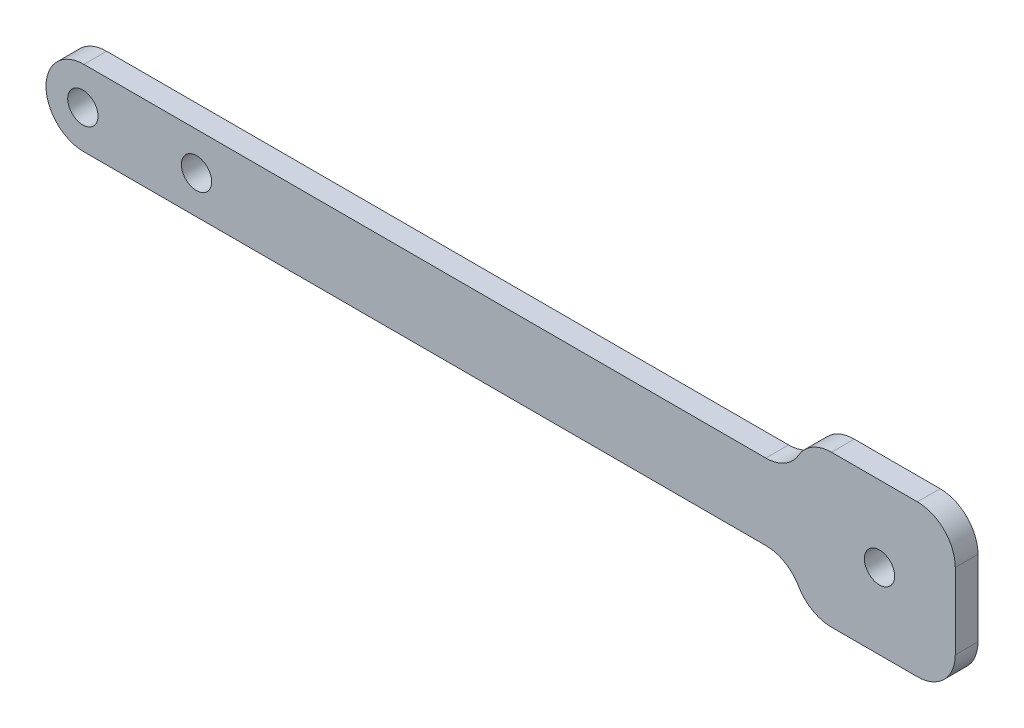
ISO-10303-21;
HEADER;
FILE_DESCRIPTION(('STEP AP214'),'2;1');
FILE_NAME('part.step','',(''),(''),'','','');
FILE_SCHEMA(('AUTOMOTIVE_DESIGN { 1 0 10303 214 1 1 1 1 }'));
ENDSEC;
DATA;
#1=APPLICATION_CONTEXT('core data for automotive mechanical design processes');
#2=APPLICATION_PROTOCOL_DEFINITION('international standard','automotive_design',2000,#1);
#3=PRODUCT_CONTEXT('',#1,'mechanical');
#4=PRODUCT('Part','Part','',(#3));
#5=PRODUCT_RELATED_PRODUCT_CATEGORY('part','',(#4));
#6=PRODUCT_DEFINITION_FORMATION('','',#4);
#7=PRODUCT_DEFINITION_CONTEXT('part definition',#1,'design');
#8=PRODUCT_DEFINITION('design','',#6,#7);
#9=PRODUCT_DEFINITION_SHAPE('','',#8);
#10=(LENGTH_UNIT() NAMED_UNIT(*) SI_UNIT(.MILLI.,.METRE.));
#11=(NAMED_UNIT(*) PLANE_ANGLE_UNIT() SI_UNIT($,.RADIAN.));
#12=(NAMED_UNIT(*) SI_UNIT($,.STERADIAN.) SOLID_ANGLE_UNIT());
#13=UNCERTAINTY_MEASURE_WITH_UNIT(LENGTH_MEASURE(1.E-05),#10,'distance_accuracy_value','');
#14=(GEOMETRIC_REPRESENTATION_CONTEXT(3) GLOBAL_UNCERTAINTY_ASSIGNED_CONTEXT((#13)) GLOBAL_UNIT_ASSIGNED_CONTEXT((#10,
#11,#12)) REPRESENTATION_CONTEXT('',''));
#15=CARTESIAN_POINT('',(0.,0.,0.));
#16=DIRECTION('',(0.,0.,1.));
#17=DIRECTION('',(1.,0.,0.));
#18=AXIS2_PLACEMENT_3D('',#15,#16,#17);
#19=CARTESIAN_POINT('',(0.,0.,3.));
#20=DIRECTION('',(0.,0.,-1.));
#21=DIRECTION('',(-1.,0.,0.));
#22=AXIS2_PLACEMENT_3D('',#19,#20,#21);
#23=PLANE('',#22);
#24=DIRECTION('',(-1.,0.,0.));
#25=VECTOR('',#24,1.);
#26=CARTESIAN_POINT('',(40.,10.,3.));
#27=LINE('',#26,#25);
#28=CARTESIAN_POINT('',(55.,10.,3.));
#29=VERTEX_POINT('',#28);
#30=CARTESIAN_POINT('',(43.6602540378444,10.,3.));
#31=VERTEX_POINT('',#30);
#32=EDGE_CURVE('E259',#29,#31,#27,.T.);
#33=ORIENTED_EDGE('',*,*,#32,.T.);
#34=CARTESIAN_POINT('',(43.6602540378444,5.,3.));
#35=DIRECTION('',(0.,0.,-1.));
#36=DIRECTION('',(-1.,0.,0.));
#37=AXIS2_PLACEMENT_3D('',#34,#35,#36);
#38=CIRCLE('',#37,5.);
#39=CARTESIAN_POINT('',(39.3301270189222,7.5,3.));
#40=VERTEX_POINT('',#39);
#41=EDGE_CURVE('E223',#31,#40,#38,.F.);
#42=ORIENTED_EDGE('',*,*,#41,.T.);
#43=CARTESIAN_POINT('',(35.,10.,3.));
#44=DIRECTION('',(0.,0.,-1.));
#45=DIRECTION('',(-1.,0.,0.));
#46=AXIS2_PLACEMENT_3D('',#43,#44,#45);
#47=CIRCLE('',#46,5.);
#48=CARTESIAN_POINT('',(35.,5.,3.));
#49=VERTEX_POINT('',#48);
#50=EDGE_CURVE('E212',#40,#49,#47,.T.);
#51=ORIENTED_EDGE('',*,*,#50,.T.);
#52=DIRECTION('',(-1.,0.,0.));
#53=VECTOR('',#52,1.);
#54=CARTESIAN_POINT('',(-60.,5.,3.));
#55=LINE('',#54,#53);
#56=CARTESIAN_POINT('',(-55.,5.,3.));
#57=VERTEX_POINT('',#56);
#58=EDGE_CURVE('E264',#49,#57,#55,.T.);
#59=ORIENTED_EDGE('',*,*,#58,.T.);
#60=CARTESIAN_POINT('',(-55.,0.,3.));
#61=DIRECTION('',(0.,0.,-1.));
#62=DIRECTION('',(-1.,0.,0.));
#63=AXIS2_PLACEMENT_3D('',#60,#61,#62);
#64=CIRCLE('',#63,5.);
#65=CARTESIAN_POINT('',(-60.,0.,3.));
#66=VERTEX_POINT('',#65);
#67=EDGE_CURVE('E181',#57,#66,#64,.F.);
#68=ORIENTED_EDGE('',*,*,#67,.T.);
#69=CARTESIAN_POINT('',(-55.,0.,3.));
#70=DIRECTION('',(0.,0.,-1.));
#71=DIRECTION('',(-1.,0.,0.));
#72=AXIS2_PLACEMENT_3D('',#69,#70,#71);
#73=CIRCLE('',#72,5.);
#74=CARTESIAN_POINT('',(-54.9999999999999,-5.,3.));
#75=VERTEX_POINT('',#74);
#76=EDGE_CURVE('E182',#66,#75,#73,.F.);
#77=ORIENTED_EDGE('',*,*,#76,.T.);
#78=DIRECTION('',(1.,0.,0.));
#79=VECTOR('',#78,1.);
#80=CARTESIAN_POINT('',(40.,-5.,3.));
#81=LINE('',#80,#79);
#82=CARTESIAN_POINT('',(35.,-5.,3.));
#83=VERTEX_POINT('',#82);
#84=EDGE_CURVE('E160',#75,#83,#81,.T.);
#85=ORIENTED_EDGE('',*,*,#84,.T.);
#86=CARTESIAN_POINT('',(35.,-10.,3.));
#87=DIRECTION('',(0.,0.,-1.));
#88=DIRECTION('',(-1.,0.,0.));
#89=AXIS2_PLACEMENT_3D('',#86,#87,#88);
#90=CIRCLE('',#89,5.);
#91=CARTESIAN_POINT('',(39.3301270189222,-7.5,3.));
#92=VERTEX_POINT('',#91);
#93=EDGE_CURVE('E210',#83,#92,#90,.T.);
#94=ORIENTED_EDGE('',*,*,#93,.T.);
#95=CARTESIAN_POINT('',(43.6602540378444,-5.,3.));
#96=DIRECTION('',(0.,0.,-1.));
#97=DIRECTION('',(-1.,0.,0.));
#98=AXIS2_PLACEMENT_3D('',#95,#96,#97);
#99=CIRCLE('',#98,5.);
#100=CARTESIAN_POINT('',(43.6602540378444,-10.,3.));
#101=VERTEX_POINT('',#100);
#102=EDGE_CURVE('E57',#92,#101,#99,.F.);
#103=ORIENTED_EDGE('',*,*,#102,.T.);
#104=DIRECTION('',(1.,0.,0.));
#105=VECTOR('',#104,1.);
#106=CARTESIAN_POINT('',(60.,-10.,3.));
#107=LINE('',#106,#105);
#108=CARTESIAN_POINT('',(55.,-10.,3.));
#109=VERTEX_POINT('',#108);
#110=EDGE_CURVE('E165',#101,#109,#107,.T.);
#111=ORIENTED_EDGE('',*,*,#110,.T.);
#112=CARTESIAN_POINT('',(55.,-5.,3.));
#113=DIRECTION('',(0.,0.,-1.));
#114=DIRECTION('',(-1.,0.,0.));
#115=AXIS2_PLACEMENT_3D('',#112,#113,#114);
#116=CIRCLE('',#115,5.);
#117=CARTESIAN_POINT('',(60.,-5.,3.));
#118=VERTEX_POINT('',#117);
#119=EDGE_CURVE('E177',#109,#118,#116,.F.);
#120=ORIENTED_EDGE('',*,*,#119,.T.);
#121=DIRECTION('',(0.,1.,0.));
#122=VECTOR('',#121,1.);
#123=CARTESIAN_POINT('',(60.,10.,3.));
#124=LINE('',#123,#122);
#125=CARTESIAN_POINT('',(60.,5.,3.));
#126=VERTEX_POINT('',#125);
#127=EDGE_CURVE('E170',#118,#126,#124,.T.);
#128=ORIENTED_EDGE('',*,*,#127,.T.);
#129=CARTESIAN_POINT('',(55.,5.,3.));
#130=DIRECTION('',(0.,0.,-1.));
#131=DIRECTION('',(-1.,0.,0.));
#132=AXIS2_PLACEMENT_3D('',#129,#130,#131);
#133=CIRCLE('',#132,5.);
#134=EDGE_CURVE('E150',#126,#29,#133,.F.);
#135=ORIENTED_EDGE('',*,*,#134,.T.);
#136=EDGE_LOOP('',(#33,#42,#51,#59,#68,#77,#85,#94,#103,#111,#120,#128,#135));
#137=FACE_BOUND('',#136,.T.);
#138=CARTESIAN_POINT('',(-55.1384875953274,0.,3.));
#139=DIRECTION('',(0.,0.,1.));
#140=DIRECTION('',(1.,0.,0.));
#141=AXIS2_PLACEMENT_3D('',#138,#139,#140);
#142=CIRCLE('',#141,2.);
#143=CARTESIAN_POINT('',(-53.1384875953274,0.,3.));
#144=VERTEX_POINT('',#143);
#145=EDGE_CURVE('E234',#144,#144,#142,.T.);
#146=ORIENTED_EDGE('',*,*,#145,.F.);
#147=EDGE_LOOP('',(#146));
#148=FACE_BOUND('',#147,.T.);
#149=CARTESIAN_POINT('',(-40.1384875953274,0.,3.));
#150=DIRECTION('',(0.,0.,1.));
#151=DIRECTION('',(1.,0.,0.));
#152=AXIS2_PLACEMENT_3D('',#149,#150,#151);
#153=CIRCLE('',#152,2.);
#154=CARTESIAN_POINT('',(-38.1384875953274,0.,3.));
#155=VERTEX_POINT('',#154);
#156=EDGE_CURVE('E273',#155,#155,#153,.T.);
#157=ORIENTED_EDGE('',*,*,#156,.F.);
#158=EDGE_LOOP('',(#157));
#159=FACE_BOUND('',#158,.T.);
#160=CARTESIAN_POINT('',(50.,0.,3.));
#161=DIRECTION('',(0.,0.,1.));
#162=DIRECTION('',(1.,0.,0.));
#163=AXIS2_PLACEMENT_3D('',#160,#161,#162);
#164=CIRCLE('',#163,2.);
#165=CARTESIAN_POINT('',(52.,0.,3.));
#166=VERTEX_POINT('',#165);
#167=EDGE_CURVE('E278',#166,#166,#164,.T.);
#168=ORIENTED_EDGE('',*,*,#167,.F.);
#169=EDGE_LOOP('',(#168));
#170=FACE_BOUND('',#169,.T.);
#171=ADVANCED_FACE('F41',(#137,#148,#159,#170),#23,.F.);
#172=CARTESIAN_POINT('',(0.,0.,0.));
#173=DIRECTION('',(0.,0.,-1.));
#174=DIRECTION('',(-1.,0.,0.));
#175=AXIS2_PLACEMENT_3D('',#172,#173,#174);
#176=PLANE('',#175);
#177=CARTESIAN_POINT('',(-40.1384875953274,0.,0.));
#178=DIRECTION('',(0.,0.,1.));
#179=DIRECTION('',(1.,0.,0.));
#180=AXIS2_PLACEMENT_3D('',#177,#178,#179);
#181=CIRCLE('',#180,2.);
#182=CARTESIAN_POINT('',(-38.1384875953274,0.,0.));
#183=VERTEX_POINT('',#182);
#184=EDGE_CURVE('E280',#183,#183,#181,.T.);
#185=ORIENTED_EDGE('',*,*,#184,.T.);
#186=EDGE_LOOP('',(#185));
#187=FACE_BOUND('',#186,.T.);
#188=CARTESIAN_POINT('',(35.,10.,0.));
#189=DIRECTION('',(0.,0.,-1.));
#190=DIRECTION('',(-1.,0.,0.));
#191=AXIS2_PLACEMENT_3D('',#188,#189,#190);
#192=CIRCLE('',#191,5.);
#193=CARTESIAN_POINT('',(35.,5.,0.));
#194=VERTEX_POINT('',#193);
#195=CARTESIAN_POINT('',(39.3301270189222,7.5,0.));
#196=VERTEX_POINT('',#195);
#197=EDGE_CURVE('E209',#194,#196,#192,.F.);
#198=ORIENTED_EDGE('',*,*,#197,.T.);
#199=CARTESIAN_POINT('',(43.6602540378444,5.,0.));
#200=DIRECTION('',(0.,0.,-1.));
#201=DIRECTION('',(-1.,0.,0.));
#202=AXIS2_PLACEMENT_3D('',#199,#200,#201);
#203=CIRCLE('',#202,5.);
#204=CARTESIAN_POINT('',(43.6602540378444,10.,0.));
#205=VERTEX_POINT('',#204);
#206=EDGE_CURVE('E218',#196,#205,#203,.T.);
#207=ORIENTED_EDGE('',*,*,#206,.T.);
#208=DIRECTION('',(-1.,0.,0.));
#209=VECTOR('',#208,1.);
#210=CARTESIAN_POINT('',(40.,10.,0.));
#211=LINE('',#210,#209);
#212=CARTESIAN_POINT('',(55.,10.,0.));
#213=VERTEX_POINT('',#212);
#214=EDGE_CURVE('E169',#213,#205,#211,.T.);
#215=ORIENTED_EDGE('',*,*,#214,.F.);
#216=CARTESIAN_POINT('',(55.,5.,0.));
#217=DIRECTION('',(0.,0.,-1.));
#218=DIRECTION('',(-1.,0.,0.));
#219=AXIS2_PLACEMENT_3D('',#216,#217,#218);
#220=CIRCLE('',#219,5.);
#221=CARTESIAN_POINT('',(60.,5.,0.));
#222=VERTEX_POINT('',#221);
#223=EDGE_CURVE('E158',#213,#222,#220,.T.);
#224=ORIENTED_EDGE('',*,*,#223,.T.);
#225=DIRECTION('',(0.,1.,0.));
#226=VECTOR('',#225,1.);
#227=CARTESIAN_POINT('',(60.,10.,0.));
#228=LINE('',#227,#226);
#229=CARTESIAN_POINT('',(60.,-5.,0.));
#230=VERTEX_POINT('',#229);
#231=EDGE_CURVE('E231',#230,#222,#228,.T.);
#232=ORIENTED_EDGE('',*,*,#231,.F.);
#233=CARTESIAN_POINT('',(55.,-5.,0.));
#234=DIRECTION('',(0.,0.,-1.));
#235=DIRECTION('',(-1.,0.,0.));
#236=AXIS2_PLACEMENT_3D('',#233,#234,#235);
#237=CIRCLE('',#236,5.);
#238=CARTESIAN_POINT('',(55.,-10.,0.));
#239=VERTEX_POINT('',#238);
#240=EDGE_CURVE('E172',#230,#239,#237,.T.);
#241=ORIENTED_EDGE('',*,*,#240,.T.);
#242=DIRECTION('',(1.,0.,0.));
#243=VECTOR('',#242,1.);
#244=CARTESIAN_POINT('',(60.,-10.,0.));
#245=LINE('',#244,#243);
#246=CARTESIAN_POINT('',(43.6602540378444,-10.,0.));
#247=VERTEX_POINT('',#246);
#248=EDGE_CURVE('E230',#247,#239,#245,.T.);
#249=ORIENTED_EDGE('',*,*,#248,.F.);
#250=CARTESIAN_POINT('',(43.6602540378444,-5.,0.));
#251=DIRECTION('',(0.,0.,-1.));
#252=DIRECTION('',(-1.,0.,0.));
#253=AXIS2_PLACEMENT_3D('',#250,#251,#252);
#254=CIRCLE('',#253,5.);
#255=CARTESIAN_POINT('',(39.3301270189222,-7.5,0.));
#256=VERTEX_POINT('',#255);
#257=EDGE_CURVE('E216',#247,#256,#254,.T.);
#258=ORIENTED_EDGE('',*,*,#257,.T.);
#259=CARTESIAN_POINT('',(35.,-10.,0.));
#260=DIRECTION('',(0.,0.,-1.));
#261=DIRECTION('',(-1.,0.,0.));
#262=AXIS2_PLACEMENT_3D('',#259,#260,#261);
#263=CIRCLE('',#262,5.);
#264=CARTESIAN_POINT('',(35.,-5.,0.));
#265=VERTEX_POINT('',#264);
#266=EDGE_CURVE('E161',#256,#265,#263,.F.);
#267=ORIENTED_EDGE('',*,*,#266,.T.);
#268=DIRECTION('',(1.,0.,0.));
#269=VECTOR('',#268,1.);
#270=CARTESIAN_POINT('',(40.,-5.,0.));
#271=LINE('',#270,#269);
#272=CARTESIAN_POINT('',(-54.9999999999999,-5.,0.));
#273=VERTEX_POINT('',#272);
#274=EDGE_CURVE('E152',#273,#265,#271,.T.);
#275=ORIENTED_EDGE('',*,*,#274,.F.);
#276=CARTESIAN_POINT('',(-55.,0.,0.));
#277=DIRECTION('',(0.,0.,-1.));
#278=DIRECTION('',(-1.,0.,0.));
#279=AXIS2_PLACEMENT_3D('',#276,#277,#278);
#280=CIRCLE('',#279,5.);
#281=CARTESIAN_POINT('',(-60.,0.,0.));
#282=VERTEX_POINT('',#281);
#283=EDGE_CURVE('E136',#273,#282,#280,.T.);
#284=ORIENTED_EDGE('',*,*,#283,.T.);
#285=CARTESIAN_POINT('',(-55.,0.,0.));
#286=DIRECTION('',(0.,0.,-1.));
#287=DIRECTION('',(-1.,0.,0.));
#288=AXIS2_PLACEMENT_3D('',#285,#286,#287);
#289=CIRCLE('',#288,5.);
#290=CARTESIAN_POINT('',(-55.,5.,0.));
#291=VERTEX_POINT('',#290);
#292=EDGE_CURVE('E149',#282,#291,#289,.T.);
#293=ORIENTED_EDGE('',*,*,#292,.T.);
#294=DIRECTION('',(-1.,0.,0.));
#295=VECTOR('',#294,1.);
#296=CARTESIAN_POINT('',(-60.,5.,0.));
#297=LINE('',#296,#295);
#298=EDGE_CURVE('E164',#194,#291,#297,.T.);
#299=ORIENTED_EDGE('',*,*,#298,.F.);
#300=EDGE_LOOP('',(#198,#207,#215,#224,#232,#241,#249,#258,#267,#275,#284,#293,#299));
#301=FACE_BOUND('',#300,.T.);
#302=CARTESIAN_POINT('',(-55.1384875953274,0.,0.));
#303=DIRECTION('',(0.,0.,1.));
#304=DIRECTION('',(1.,0.,0.));
#305=AXIS2_PLACEMENT_3D('',#302,#303,#304);
#306=CIRCLE('',#305,2.);
#307=CARTESIAN_POINT('',(-53.1384875953274,0.,0.));
#308=VERTEX_POINT('',#307);
#309=EDGE_CURVE('E237',#308,#308,#306,.T.);
#310=ORIENTED_EDGE('',*,*,#309,.T.);
#311=EDGE_LOOP('',(#310));
#312=FACE_BOUND('',#311,.T.);
#313=CARTESIAN_POINT('',(50.,0.,0.));
#314=DIRECTION('',(0.,0.,1.));
#315=DIRECTION('',(1.,0.,0.));
#316=AXIS2_PLACEMENT_3D('',#313,#314,#315);
#317=CIRCLE('',#316,2.);
#318=CARTESIAN_POINT('',(52.,0.,0.));
#319=VERTEX_POINT('',#318);
#320=EDGE_CURVE('E201',#319,#319,#317,.T.);
#321=ORIENTED_EDGE('',*,*,#320,.T.);
#322=EDGE_LOOP('',(#321));
#323=FACE_BOUND('',#322,.T.);
#324=ADVANCED_FACE('F163',(#187,#301,#312,#323),#176,.T.);
#325=CARTESIAN_POINT('',(60.,-10.,3.));
#326=DIRECTION('',(0.,1.,0.));
#327=DIRECTION('',(0.,0.,1.));
#328=AXIS2_PLACEMENT_3D('',#325,#326,#327);
#329=PLANE('',#328);
#330=ORIENTED_EDGE('',*,*,#110,.F.);
#331=DIRECTION('',(0.,0.,1.));
#332=VECTOR('',#331,1.);
#333=CARTESIAN_POINT('',(43.6602540378444,-10.,3.));
#334=LINE('',#333,#332);
#335=EDGE_CURVE('E47',#101,#247,#334,.F.);
#336=ORIENTED_EDGE('',*,*,#335,.T.);
#337=ORIENTED_EDGE('',*,*,#248,.T.);
#338=DIRECTION('',(0.,0.,-1.));
#339=VECTOR('',#338,1.);
#340=CARTESIAN_POINT('',(55.,-10.,3.));
#341=LINE('',#340,#339);
#342=EDGE_CURVE('E194',#239,#109,#341,.F.);
#343=ORIENTED_EDGE('',*,*,#342,.T.);
#344=EDGE_LOOP('',(#330,#336,#337,#343));
#345=FACE_BOUND('',#344,.T.);
#346=ADVANCED_FACE('F226',(#345),#329,.F.);
#347=CARTESIAN_POINT('',(60.,10.,3.));
#348=DIRECTION('',(-1.,0.,0.));
#349=DIRECTION('',(0.,0.,1.));
#350=AXIS2_PLACEMENT_3D('',#347,#348,#349);
#351=PLANE('',#350);
#352=ORIENTED_EDGE('',*,*,#127,.F.);
#353=DIRECTION('',(0.,0.,-1.));
#354=VECTOR('',#353,1.);
#355=CARTESIAN_POINT('',(60.,-5.,3.));
#356=LINE('',#355,#354);
#357=EDGE_CURVE('E188',#118,#230,#356,.T.);
#358=ORIENTED_EDGE('',*,*,#357,.T.);
#359=ORIENTED_EDGE('',*,*,#231,.T.);
#360=DIRECTION('',(0.,0.,-1.));
#361=VECTOR('',#360,1.);
#362=CARTESIAN_POINT('',(60.,5.,3.));
#363=LINE('',#362,#361);
#364=EDGE_CURVE('E189',#222,#126,#363,.F.);
#365=ORIENTED_EDGE('',*,*,#364,.T.);
#366=EDGE_LOOP('',(#352,#358,#359,#365));
#367=FACE_BOUND('',#366,.T.);
#368=ADVANCED_FACE('F308',(#367),#351,.F.);
#369=CARTESIAN_POINT('',(40.,10.,3.));
#370=DIRECTION('',(0.,-1.,0.));
#371=DIRECTION('',(0.,0.,-1.));
#372=AXIS2_PLACEMENT_3D('',#369,#370,#371);
#373=PLANE('',#372);
#374=ORIENTED_EDGE('',*,*,#214,.T.);
#375=DIRECTION('',(0.,0.,1.));
#376=VECTOR('',#375,1.);
#377=CARTESIAN_POINT('',(43.6602540378444,10.,3.));
#378=LINE('',#377,#376);
#379=EDGE_CURVE('E219',#205,#31,#378,.T.);
#380=ORIENTED_EDGE('',*,*,#379,.T.);
#381=ORIENTED_EDGE('',*,*,#32,.F.);
#382=DIRECTION('',(0.,0.,-1.));
#383=VECTOR('',#382,1.);
#384=CARTESIAN_POINT('',(55.,10.,3.));
#385=LINE('',#384,#383);
#386=EDGE_CURVE('E196',#29,#213,#385,.T.);
#387=ORIENTED_EDGE('',*,*,#386,.T.);
#388=EDGE_LOOP('',(#374,#380,#381,#387));
#389=FACE_BOUND('',#388,.T.);
#390=ADVANCED_FACE('F250',(#389),#373,.F.);
#391=CARTESIAN_POINT('',(-60.,5.,3.));
#392=DIRECTION('',(0.,-1.,0.));
#393=DIRECTION('',(0.,0.,-1.));
#394=AXIS2_PLACEMENT_3D('',#391,#392,#393);
#395=PLANE('',#394);
#396=ORIENTED_EDGE('',*,*,#58,.F.);
#397=DIRECTION('',(0.,0.,-1.));
#398=VECTOR('',#397,1.);
#399=CARTESIAN_POINT('',(35.,5.,0.));
#400=LINE('',#399,#398);
#401=EDGE_CURVE('E203',#49,#194,#400,.T.);
#402=ORIENTED_EDGE('',*,*,#401,.T.);
#403=ORIENTED_EDGE('',*,*,#298,.T.);
#404=DIRECTION('',(0.,0.,-1.));
#405=VECTOR('',#404,1.);
#406=CARTESIAN_POINT('',(-55.,5.,3.));
#407=LINE('',#406,#405);
#408=EDGE_CURVE('E184',#291,#57,#407,.F.);
#409=ORIENTED_EDGE('',*,*,#408,.T.);
#410=EDGE_LOOP('',(#396,#402,#403,#409));
#411=FACE_BOUND('',#410,.T.);
#412=ADVANCED_FACE('F262',(#411),#395,.F.);
#413=CARTESIAN_POINT('',(40.,-5.,3.));
#414=DIRECTION('',(0.,1.,0.));
#415=DIRECTION('',(0.,0.,1.));
#416=AXIS2_PLACEMENT_3D('',#413,#414,#415);
#417=PLANE('',#416);
#418=ORIENTED_EDGE('',*,*,#274,.T.);
#419=DIRECTION('',(0.,0.,-1.));
#420=VECTOR('',#419,1.);
#421=CARTESIAN_POINT('',(35.,-5.,3.));
#422=LINE('',#421,#420);
#423=EDGE_CURVE('E197',#265,#83,#422,.F.);
#424=ORIENTED_EDGE('',*,*,#423,.T.);
#425=ORIENTED_EDGE('',*,*,#84,.F.);
#426=DIRECTION('',(0.,0.,-1.));
#427=VECTOR('',#426,1.);
#428=CARTESIAN_POINT('',(-55.,-5.,3.));
#429=LINE('',#428,#427);
#430=EDGE_CURVE('E139',#75,#273,#429,.T.);
#431=ORIENTED_EDGE('',*,*,#430,.T.);
#432=EDGE_LOOP('',(#418,#424,#425,#431));
#433=FACE_BOUND('',#432,.T.);
#434=ADVANCED_FACE('F153',(#433),#417,.F.);
#435=CARTESIAN_POINT('',(-55.1384875953274,0.,3.));
#436=DIRECTION('',(0.,0.,-1.));
#437=DIRECTION('',(-1.,0.,0.));
#438=AXIS2_PLACEMENT_3D('',#435,#436,#437);
#439=CYLINDRICAL_SURFACE('',#438,2.);
#440=ORIENTED_EDGE('',*,*,#145,.T.);
#441=EDGE_LOOP('',(#440));
#442=FACE_BOUND('',#441,.T.);
#443=ORIENTED_EDGE('',*,*,#309,.F.);
#444=EDGE_LOOP('',(#443));
#445=FACE_BOUND('',#444,.T.);
#446=ADVANCED_FACE('F297',(#442,#445),#439,.F.);
#447=CARTESIAN_POINT('',(-40.1384875953274,0.,3.));
#448=DIRECTION('',(0.,0.,-1.));
#449=DIRECTION('',(-1.,0.,0.));
#450=AXIS2_PLACEMENT_3D('',#447,#448,#449);
#451=CYLINDRICAL_SURFACE('',#450,2.);
#452=ORIENTED_EDGE('',*,*,#156,.T.);
#453=EDGE_LOOP('',(#452));
#454=FACE_BOUND('',#453,.T.);
#455=ORIENTED_EDGE('',*,*,#184,.F.);
#456=EDGE_LOOP('',(#455));
#457=FACE_BOUND('',#456,.T.);
#458=ADVANCED_FACE('F387',(#454,#457),#451,.F.);
#459=CARTESIAN_POINT('',(50.,0.,3.));
#460=DIRECTION('',(0.,0.,-1.));
#461=DIRECTION('',(-1.,0.,0.));
#462=AXIS2_PLACEMENT_3D('',#459,#460,#461);
#463=CYLINDRICAL_SURFACE('',#462,2.);
#464=ORIENTED_EDGE('',*,*,#167,.T.);
#465=EDGE_LOOP('',(#464));
#466=FACE_BOUND('',#465,.T.);
#467=ORIENTED_EDGE('',*,*,#320,.F.);
#468=EDGE_LOOP('',(#467));
#469=FACE_BOUND('',#468,.T.);
#470=ADVANCED_FACE('F288',(#466,#469),#463,.F.);
#471=CARTESIAN_POINT('',(-55.,0.,3.));
#472=DIRECTION('',(0.,0.,-1.));
#473=DIRECTION('',(-1.,0.,0.));
#474=AXIS2_PLACEMENT_3D('',#471,#472,#473);
#475=CYLINDRICAL_SURFACE('',#474,5.);
#476=DIRECTION('',(0.,0.,-1.));
#477=VECTOR('',#476,1.);
#478=CARTESIAN_POINT('',(-60.,0.,3.));
#479=LINE('',#478,#477);
#480=EDGE_CURVE('E145',#66,#282,#479,.T.);
#481=ORIENTED_EDGE('',*,*,#480,.F.);
#482=ORIENTED_EDGE('',*,*,#67,.F.);
#483=ORIENTED_EDGE('',*,*,#408,.F.);
#484=ORIENTED_EDGE('',*,*,#292,.F.);
#485=EDGE_LOOP('',(#481,#482,#483,#484));
#486=FACE_BOUND('',#485,.T.);
#487=ADVANCED_FACE('F267',(#486),#475,.T.);
#488=CARTESIAN_POINT('',(-55.,0.,3.));
#489=DIRECTION('',(0.,0.,-1.));
#490=DIRECTION('',(-1.,0.,0.));
#491=AXIS2_PLACEMENT_3D('',#488,#489,#490);
#492=CYLINDRICAL_SURFACE('',#491,5.);
#493=ORIENTED_EDGE('',*,*,#76,.F.);
#494=ORIENTED_EDGE('',*,*,#480,.T.);
#495=ORIENTED_EDGE('',*,*,#283,.F.);
#496=ORIENTED_EDGE('',*,*,#430,.F.);
#497=EDGE_LOOP('',(#493,#494,#495,#496));
#498=FACE_BOUND('',#497,.T.);
#499=ADVANCED_FACE('F137',(#498),#492,.T.);
#500=CARTESIAN_POINT('',(55.,-5.,3.));
#501=DIRECTION('',(0.,0.,-1.));
#502=DIRECTION('',(-1.,0.,0.));
#503=AXIS2_PLACEMENT_3D('',#500,#501,#502);
#504=CYLINDRICAL_SURFACE('',#503,5.);
#505=ORIENTED_EDGE('',*,*,#119,.F.);
#506=ORIENTED_EDGE('',*,*,#342,.F.);
#507=ORIENTED_EDGE('',*,*,#240,.F.);
#508=ORIENTED_EDGE('',*,*,#357,.F.);
#509=EDGE_LOOP('',(#505,#506,#507,#508));
#510=FACE_BOUND('',#509,.T.);
#511=ADVANCED_FACE('F317',(#510),#504,.T.);
#512=CARTESIAN_POINT('',(55.,5.,3.));
#513=DIRECTION('',(0.,0.,-1.));
#514=DIRECTION('',(-1.,0.,0.));
#515=AXIS2_PLACEMENT_3D('',#512,#513,#514);
#516=CYLINDRICAL_SURFACE('',#515,5.);
#517=ORIENTED_EDGE('',*,*,#134,.F.);
#518=ORIENTED_EDGE('',*,*,#364,.F.);
#519=ORIENTED_EDGE('',*,*,#223,.F.);
#520=ORIENTED_EDGE('',*,*,#386,.F.);
#521=EDGE_LOOP('',(#517,#518,#519,#520));
#522=FACE_BOUND('',#521,.T.);
#523=ADVANCED_FACE('F322',(#522),#516,.T.);
#524=CARTESIAN_POINT('',(35.,-10.,3.));
#525=DIRECTION('',(0.,0.,1.));
#526=DIRECTION('',(1.,0.,0.));
#527=AXIS2_PLACEMENT_3D('',#524,#525,#526);
#528=CYLINDRICAL_SURFACE('',#527,5.);
#529=ORIENTED_EDGE('',*,*,#266,.F.);
#530=DIRECTION('',(0.,0.,1.));
#531=VECTOR('',#530,1.);
#532=CARTESIAN_POINT('',(39.3301270189222,-7.5,3.));
#533=LINE('',#532,#531);
#534=EDGE_CURVE('E11',#256,#92,#533,.T.);
#535=ORIENTED_EDGE('',*,*,#534,.T.);
#536=ORIENTED_EDGE('',*,*,#93,.F.);
#537=ORIENTED_EDGE('',*,*,#423,.F.);
#538=EDGE_LOOP('',(#529,#535,#536,#537));
#539=FACE_BOUND('',#538,.T.);
#540=ADVANCED_FACE('F323',(#539),#528,.F.);
#541=CARTESIAN_POINT('',(35.,10.,3.));
#542=DIRECTION('',(0.,0.,1.));
#543=DIRECTION('',(1.,0.,0.));
#544=AXIS2_PLACEMENT_3D('',#541,#542,#543);
#545=CYLINDRICAL_SURFACE('',#544,5.);
#546=ORIENTED_EDGE('',*,*,#50,.F.);
#547=DIRECTION('',(0.,0.,1.));
#548=VECTOR('',#547,1.);
#549=CARTESIAN_POINT('',(39.3301270189222,7.5,3.));
#550=LINE('',#549,#548);
#551=EDGE_CURVE('E214',#40,#196,#550,.F.);
#552=ORIENTED_EDGE('',*,*,#551,.T.);
#553=ORIENTED_EDGE('',*,*,#197,.F.);
#554=ORIENTED_EDGE('',*,*,#401,.F.);
#555=EDGE_LOOP('',(#546,#552,#553,#554));
#556=FACE_BOUND('',#555,.T.);
#557=ADVANCED_FACE('F261',(#556),#545,.F.);
#558=CARTESIAN_POINT('',(43.6602540378444,5.,3.));
#559=DIRECTION('',(0.,0.,1.));
#560=DIRECTION('',(1.,0.,0.));
#561=AXIS2_PLACEMENT_3D('',#558,#559,#560);
#562=CYLINDRICAL_SURFACE('',#561,5.);
#563=ORIENTED_EDGE('',*,*,#41,.F.);
#564=ORIENTED_EDGE('',*,*,#379,.F.);
#565=ORIENTED_EDGE('',*,*,#206,.F.);
#566=ORIENTED_EDGE('',*,*,#551,.F.);
#567=EDGE_LOOP('',(#563,#564,#565,#566));
#568=FACE_BOUND('',#567,.T.);
#569=ADVANCED_FACE('F254',(#568),#562,.T.);
#570=CARTESIAN_POINT('',(43.6602540378444,-5.,3.));
#571=DIRECTION('',(0.,0.,1.));
#572=DIRECTION('',(1.,0.,0.));
#573=AXIS2_PLACEMENT_3D('',#570,#571,#572);
#574=CYLINDRICAL_SURFACE('',#573,5.);
#575=ORIENTED_EDGE('',*,*,#102,.F.);
#576=ORIENTED_EDGE('',*,*,#534,.F.);
#577=ORIENTED_EDGE('',*,*,#257,.F.);
#578=ORIENTED_EDGE('',*,*,#335,.F.);
#579=EDGE_LOOP('',(#575,#576,#577,#578));
#580=FACE_BOUND('',#579,.T.);
#581=ADVANCED_FACE('F43',(#580),#574,.T.);
#582=CLOSED_SHELL('',(#171,#324,#346,#368,#390,#412,#434,#446,#458,#470,#487,#499,#511,#523,
#540,#557,#569,#581));
#583=MANIFOLD_SOLID_BREP('B2',#582);
#584=ADVANCED_BREP_SHAPE_REPRESENTATION('',(#18,#583),#14);
#585=SHAPE_DEFINITION_REPRESENTATION(#9,#584);
ENDSEC;
END-ISO-10303-21;
